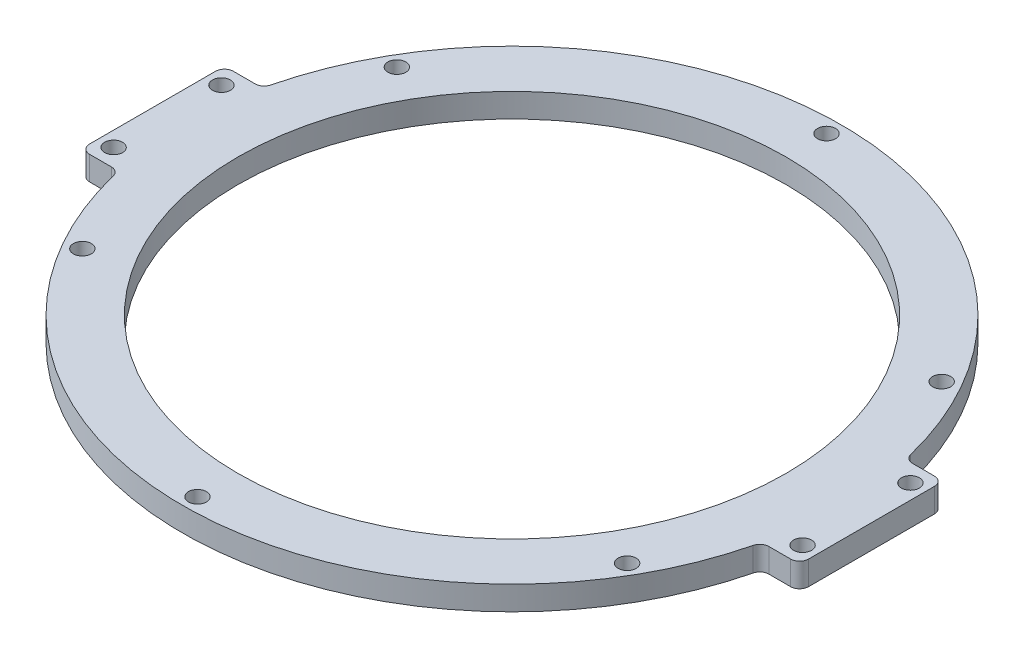
ISO-10303-21;
HEADER;
FILE_DESCRIPTION(('STEP AP214'),'2;1');
FILE_NAME('part.step','',(''),(''),'','','');
FILE_SCHEMA(('AUTOMOTIVE_DESIGN { 1 0 10303 214 1 1 1 1 }'));
ENDSEC;
DATA;
#1=APPLICATION_CONTEXT('core data for automotive mechanical design processes');
#2=APPLICATION_PROTOCOL_DEFINITION('international standard','automotive_design',2000,#1);
#3=PRODUCT_CONTEXT('',#1,'mechanical');
#4=PRODUCT('Part','Part','',(#3));
#5=PRODUCT_RELATED_PRODUCT_CATEGORY('part','',(#4));
#6=PRODUCT_DEFINITION_FORMATION('','',#4);
#7=PRODUCT_DEFINITION_CONTEXT('part definition',#1,'design');
#8=PRODUCT_DEFINITION('design','',#6,#7);
#9=PRODUCT_DEFINITION_SHAPE('','',#8);
#10=(LENGTH_UNIT() NAMED_UNIT(*) SI_UNIT(.MILLI.,.METRE.));
#11=(NAMED_UNIT(*) PLANE_ANGLE_UNIT() SI_UNIT($,.RADIAN.));
#12=(NAMED_UNIT(*) SI_UNIT($,.STERADIAN.) SOLID_ANGLE_UNIT());
#13=UNCERTAINTY_MEASURE_WITH_UNIT(LENGTH_MEASURE(1.E-05),#10,'distance_accuracy_value','');
#14=(GEOMETRIC_REPRESENTATION_CONTEXT(3) GLOBAL_UNCERTAINTY_ASSIGNED_CONTEXT((#13)) GLOBAL_UNIT_ASSIGNED_CONTEXT((#10,
#11,#12)) REPRESENTATION_CONTEXT('',''));
#15=CARTESIAN_POINT('',(0.,0.,0.));
#16=DIRECTION('',(0.,0.,1.));
#17=DIRECTION('',(1.,0.,0.));
#18=AXIS2_PLACEMENT_3D('',#15,#16,#17);
#19=CARTESIAN_POINT('',(58.5,4.,-10.5));
#20=DIRECTION('',(0.,-1.,0.));
#21=DIRECTION('',(0.,0.,-1.));
#22=AXIS2_PLACEMENT_3D('',#19,#20,#21);
#23=PLANE('',#22);
#24=CARTESIAN_POINT('',(58.5,4.,-10.5));
#25=DIRECTION('',(0.,1.,0.));
#26=DIRECTION('',(0.,0.,-1.));
#27=AXIS2_PLACEMENT_3D('',#24,#25,#26);
#28=CIRCLE('',#27,1.5);
#29=CARTESIAN_POINT('',(60.,4.,-10.5));
#30=VERTEX_POINT('',#29);
#31=CARTESIAN_POINT('',(58.5,4.,-12.));
#32=VERTEX_POINT('',#31);
#33=EDGE_CURVE('E242',#30,#32,#28,.T.);
#34=ORIENTED_EDGE('',*,*,#33,.T.);
#35=DIRECTION('',(-1.,0.,0.));
#36=VECTOR('',#35,1.);
#37=CARTESIAN_POINT('',(58.5,4.,-12.));
#38=LINE('',#37,#36);
#39=CARTESIAN_POINT('',(54.8634668973808,4.,-12.));
#40=VERTEX_POINT('',#39);
#41=EDGE_CURVE('E130',#32,#40,#38,.T.);
#42=ORIENTED_EDGE('',*,*,#41,.T.);
#43=CARTESIAN_POINT('',(54.8634668973808,4.,-13.5));
#44=DIRECTION('',(0.,-1.,0.));
#45=DIRECTION('',(0.,0.,1.));
#46=AXIS2_PLACEMENT_3D('',#43,#44,#45);
#47=CIRCLE('',#46,1.5);
#48=CARTESIAN_POINT('',(53.4069146788663,4.,-13.141592920354));
#49=VERTEX_POINT('',#48);
#50=EDGE_CURVE('E295',#40,#49,#47,.T.);
#51=ORIENTED_EDGE('',*,*,#50,.T.);
#52=CARTESIAN_POINT('',(0.,4.,0.));
#53=DIRECTION('',(0.,1.,0.));
#54=DIRECTION('',(0.,0.,1.));
#55=AXIS2_PLACEMENT_3D('',#52,#53,#54);
#56=CIRCLE('',#55,55.);
#57=CARTESIAN_POINT('',(-53.4069146788663,4.,-13.141592920354));
#58=VERTEX_POINT('',#57);
#59=EDGE_CURVE('E315',#49,#58,#56,.T.);
#60=ORIENTED_EDGE('',*,*,#59,.T.);
#61=CARTESIAN_POINT('',(-54.8634668973808,4.,-13.5));
#62=DIRECTION('',(0.,-1.,0.));
#63=DIRECTION('',(0.,0.,-1.));
#64=AXIS2_PLACEMENT_3D('',#61,#62,#63);
#65=CIRCLE('',#64,1.5);
#66=CARTESIAN_POINT('',(-54.8634668973808,4.,-12.));
#67=VERTEX_POINT('',#66);
#68=EDGE_CURVE('E311',#58,#67,#65,.T.);
#69=ORIENTED_EDGE('',*,*,#68,.T.);
#70=DIRECTION('',(-1.,0.,0.));
#71=VECTOR('',#70,1.);
#72=CARTESIAN_POINT('',(-58.5,4.,-12.));
#73=LINE('',#72,#71);
#74=CARTESIAN_POINT('',(-58.5,4.,-12.));
#75=VERTEX_POINT('',#74);
#76=EDGE_CURVE('E314',#67,#75,#73,.T.);
#77=ORIENTED_EDGE('',*,*,#76,.T.);
#78=CARTESIAN_POINT('',(-58.5,4.,-10.5));
#79=DIRECTION('',(0.,1.,0.));
#80=DIRECTION('',(0.,0.,1.));
#81=AXIS2_PLACEMENT_3D('',#78,#79,#80);
#82=CIRCLE('',#81,1.5);
#83=CARTESIAN_POINT('',(-60.,4.,-10.5));
#84=VERTEX_POINT('',#83);
#85=EDGE_CURVE('E319',#75,#84,#82,.T.);
#86=ORIENTED_EDGE('',*,*,#85,.T.);
#87=DIRECTION('',(0.,0.,1.));
#88=VECTOR('',#87,1.);
#89=CARTESIAN_POINT('',(-60.,4.,10.5));
#90=LINE('',#89,#88);
#91=CARTESIAN_POINT('',(-60.,4.,10.5));
#92=VERTEX_POINT('',#91);
#93=EDGE_CURVE('E326',#84,#92,#90,.T.);
#94=ORIENTED_EDGE('',*,*,#93,.T.);
#95=CARTESIAN_POINT('',(-58.5,4.,10.5));
#96=DIRECTION('',(0.,1.,0.));
#97=DIRECTION('',(0.,0.,-1.));
#98=AXIS2_PLACEMENT_3D('',#95,#96,#97);
#99=CIRCLE('',#98,1.5);
#100=CARTESIAN_POINT('',(-58.5,4.,12.));
#101=VERTEX_POINT('',#100);
#102=EDGE_CURVE('E329',#92,#101,#99,.T.);
#103=ORIENTED_EDGE('',*,*,#102,.T.);
#104=DIRECTION('',(1.,0.,0.));
#105=VECTOR('',#104,1.);
#106=CARTESIAN_POINT('',(-58.5,4.,12.));
#107=LINE('',#106,#105);
#108=CARTESIAN_POINT('',(-54.8634668973808,4.,12.));
#109=VERTEX_POINT('',#108);
#110=EDGE_CURVE('E332',#101,#109,#107,.T.);
#111=ORIENTED_EDGE('',*,*,#110,.T.);
#112=CARTESIAN_POINT('',(-54.8634668973808,4.,13.5));
#113=DIRECTION('',(0.,-1.,0.));
#114=DIRECTION('',(0.,0.,1.));
#115=AXIS2_PLACEMENT_3D('',#112,#113,#114);
#116=CIRCLE('',#115,1.5);
#117=CARTESIAN_POINT('',(-53.4069146788663,4.,13.141592920354));
#118=VERTEX_POINT('',#117);
#119=EDGE_CURVE('E335',#109,#118,#116,.T.);
#120=ORIENTED_EDGE('',*,*,#119,.T.);
#121=CARTESIAN_POINT('',(0.,4.,0.));
#122=DIRECTION('',(0.,1.,0.));
#123=DIRECTION('',(0.,0.,1.));
#124=AXIS2_PLACEMENT_3D('',#121,#122,#123);
#125=CIRCLE('',#124,55.);
#126=CARTESIAN_POINT('',(53.4069146788663,4.,13.141592920354));
#127=VERTEX_POINT('',#126);
#128=EDGE_CURVE('E338',#118,#127,#125,.T.);
#129=ORIENTED_EDGE('',*,*,#128,.T.);
#130=CARTESIAN_POINT('',(54.8634668973808,4.,13.5));
#131=DIRECTION('',(0.,-1.,0.));
#132=DIRECTION('',(0.,0.,-1.));
#133=AXIS2_PLACEMENT_3D('',#130,#131,#132);
#134=CIRCLE('',#133,1.5);
#135=CARTESIAN_POINT('',(54.8634668973808,4.,12.));
#136=VERTEX_POINT('',#135);
#137=EDGE_CURVE('E173',#127,#136,#134,.T.);
#138=ORIENTED_EDGE('',*,*,#137,.T.);
#139=DIRECTION('',(1.,0.,0.));
#140=VECTOR('',#139,1.);
#141=CARTESIAN_POINT('',(58.5,4.,12.));
#142=LINE('',#141,#140);
#143=CARTESIAN_POINT('',(58.5,4.,12.));
#144=VERTEX_POINT('',#143);
#145=EDGE_CURVE('E167',#136,#144,#142,.T.);
#146=ORIENTED_EDGE('',*,*,#145,.T.);
#147=CARTESIAN_POINT('',(58.5,4.,10.5));
#148=DIRECTION('',(0.,1.,0.));
#149=DIRECTION('',(0.,0.,1.));
#150=AXIS2_PLACEMENT_3D('',#147,#148,#149);
#151=CIRCLE('',#150,1.5);
#152=CARTESIAN_POINT('',(60.,4.,10.5));
#153=VERTEX_POINT('',#152);
#154=EDGE_CURVE('E171',#144,#153,#151,.T.);
#155=ORIENTED_EDGE('',*,*,#154,.T.);
#156=DIRECTION('',(0.,0.,-1.));
#157=VECTOR('',#156,1.);
#158=CARTESIAN_POINT('',(60.,4.,10.5));
#159=LINE('',#158,#157);
#160=EDGE_CURVE('E63',#153,#30,#159,.T.);
#161=ORIENTED_EDGE('',*,*,#160,.T.);
#162=EDGE_LOOP('',(#34,#42,#51,#60,#69,#77,#86,#94,#103,#111,#120,#129,#138,#146,#155,#161));
#163=FACE_BOUND('',#162,.T.);
#164=CARTESIAN_POINT('',(0.,4.,0.));
#165=DIRECTION('',(0.,1.,0.));
#166=DIRECTION('',(0.,0.,1.));
#167=AXIS2_PLACEMENT_3D('',#164,#165,#166);
#168=CIRCLE('',#167,45.75);
#169=CARTESIAN_POINT('',(0.,4.,45.75));
#170=VERTEX_POINT('',#169);
#171=EDGE_CURVE('E200',#170,#170,#168,.T.);
#172=ORIENTED_EDGE('',*,*,#171,.F.);
#173=EDGE_LOOP('',(#172));
#174=FACE_BOUND('',#173,.T.);
#175=CARTESIAN_POINT('',(0.,4.,-52.5));
#176=DIRECTION('',(0.,1.,0.));
#177=DIRECTION('',(0.,0.,1.));
#178=AXIS2_PLACEMENT_3D('',#175,#176,#177);
#179=CIRCLE('',#178,1.5);
#180=CARTESIAN_POINT('',(0.,4.,-51.));
#181=VERTEX_POINT('',#180);
#182=EDGE_CURVE('E492',#181,#181,#179,.T.);
#183=ORIENTED_EDGE('',*,*,#182,.F.);
#184=EDGE_LOOP('',(#183));
#185=FACE_BOUND('',#184,.T.);
#186=CARTESIAN_POINT('',(57.5,4.,-9.));
#187=DIRECTION('',(0.,1.,0.));
#188=DIRECTION('',(0.,0.,-1.));
#189=AXIS2_PLACEMENT_3D('',#186,#187,#188);
#190=CIRCLE('',#189,1.5);
#191=CARTESIAN_POINT('',(57.5,4.,-10.5));
#192=VERTEX_POINT('',#191);
#193=EDGE_CURVE('E484',#192,#192,#190,.T.);
#194=ORIENTED_EDGE('',*,*,#193,.F.);
#195=EDGE_LOOP('',(#194));
#196=FACE_BOUND('',#195,.T.);
#197=CARTESIAN_POINT('',(45.466333698683,4.,-26.25));
#198=DIRECTION('',(0.,1.,0.));
#199=DIRECTION('',(0.,0.,1.));
#200=AXIS2_PLACEMENT_3D('',#197,#198,#199);
#201=CIRCLE('',#200,1.5);
#202=CARTESIAN_POINT('',(45.466333698683,4.,-24.75));
#203=VERTEX_POINT('',#202);
#204=EDGE_CURVE('E476',#203,#203,#201,.T.);
#205=ORIENTED_EDGE('',*,*,#204,.F.);
#206=EDGE_LOOP('',(#205));
#207=FACE_BOUND('',#206,.T.);
#208=CARTESIAN_POINT('',(45.466333698683,4.,26.25));
#209=DIRECTION('',(0.,1.,0.));
#210=DIRECTION('',(0.,0.,1.));
#211=AXIS2_PLACEMENT_3D('',#208,#209,#210);
#212=CIRCLE('',#211,1.5);
#213=CARTESIAN_POINT('',(45.466333698683,4.,27.75));
#214=VERTEX_POINT('',#213);
#215=EDGE_CURVE('E468',#214,#214,#212,.T.);
#216=ORIENTED_EDGE('',*,*,#215,.F.);
#217=EDGE_LOOP('',(#216));
#218=FACE_BOUND('',#217,.T.);
#219=CARTESIAN_POINT('',(0.,4.,52.5));
#220=DIRECTION('',(0.,1.,0.));
#221=DIRECTION('',(0.,0.,1.));
#222=AXIS2_PLACEMENT_3D('',#219,#220,#221);
#223=CIRCLE('',#222,1.5);
#224=CARTESIAN_POINT('',(0.,4.,54.));
#225=VERTEX_POINT('',#224);
#226=EDGE_CURVE('E460',#225,#225,#223,.T.);
#227=ORIENTED_EDGE('',*,*,#226,.F.);
#228=EDGE_LOOP('',(#227));
#229=FACE_BOUND('',#228,.T.);
#230=CARTESIAN_POINT('',(-45.466333698683,4.,26.25));
#231=DIRECTION('',(0.,1.,0.));
#232=DIRECTION('',(0.,0.,1.));
#233=AXIS2_PLACEMENT_3D('',#230,#231,#232);
#234=CIRCLE('',#233,1.5);
#235=CARTESIAN_POINT('',(-45.466333698683,4.,27.75));
#236=VERTEX_POINT('',#235);
#237=EDGE_CURVE('E452',#236,#236,#234,.T.);
#238=ORIENTED_EDGE('',*,*,#237,.F.);
#239=EDGE_LOOP('',(#238));
#240=FACE_BOUND('',#239,.T.);
#241=CARTESIAN_POINT('',(-45.466333698683,4.,-26.25));
#242=DIRECTION('',(0.,1.,0.));
#243=DIRECTION('',(0.,0.,1.));
#244=AXIS2_PLACEMENT_3D('',#241,#242,#243);
#245=CIRCLE('',#244,1.5);
#246=CARTESIAN_POINT('',(-45.466333698683,4.,-24.75));
#247=VERTEX_POINT('',#246);
#248=EDGE_CURVE('E444',#247,#247,#245,.T.);
#249=ORIENTED_EDGE('',*,*,#248,.F.);
#250=EDGE_LOOP('',(#249));
#251=FACE_BOUND('',#250,.T.);
#252=CARTESIAN_POINT('',(-57.5,4.,-9.));
#253=DIRECTION('',(0.,1.,0.));
#254=DIRECTION('',(0.,0.,1.));
#255=AXIS2_PLACEMENT_3D('',#252,#253,#254);
#256=CIRCLE('',#255,1.5);
#257=CARTESIAN_POINT('',(-57.5,4.,-7.49999999999999));
#258=VERTEX_POINT('',#257);
#259=EDGE_CURVE('E436',#258,#258,#256,.T.);
#260=ORIENTED_EDGE('',*,*,#259,.F.);
#261=EDGE_LOOP('',(#260));
#262=FACE_BOUND('',#261,.T.);
#263=CARTESIAN_POINT('',(57.5,4.,9.));
#264=DIRECTION('',(0.,1.,0.));
#265=DIRECTION('',(0.,0.,1.));
#266=AXIS2_PLACEMENT_3D('',#263,#264,#265);
#267=CIRCLE('',#266,1.5);
#268=CARTESIAN_POINT('',(57.5,4.,10.5));
#269=VERTEX_POINT('',#268);
#270=EDGE_CURVE('E428',#269,#269,#267,.T.);
#271=ORIENTED_EDGE('',*,*,#270,.F.);
#272=EDGE_LOOP('',(#271));
#273=FACE_BOUND('',#272,.T.);
#274=CARTESIAN_POINT('',(-57.5,4.,9.));
#275=DIRECTION('',(0.,1.,0.));
#276=DIRECTION('',(0.,0.,-1.));
#277=AXIS2_PLACEMENT_3D('',#274,#275,#276);
#278=CIRCLE('',#277,1.5);
#279=CARTESIAN_POINT('',(-57.5,4.,7.49999999999999));
#280=VERTEX_POINT('',#279);
#281=EDGE_CURVE('E417',#280,#280,#278,.T.);
#282=ORIENTED_EDGE('',*,*,#281,.F.);
#283=EDGE_LOOP('',(#282));
#284=FACE_BOUND('',#283,.T.);
#285=ADVANCED_FACE('F45',(#163,#174,#185,#196,#207,#218,#229,#240,#251,#262,#273,#284),#23,.F.);
#286=CARTESIAN_POINT('',(58.5,0.,-10.5));
#287=DIRECTION('',(0.,-1.,0.));
#288=DIRECTION('',(0.,0.,-1.));
#289=AXIS2_PLACEMENT_3D('',#286,#287,#288);
#290=PLANE('',#289);
#291=CARTESIAN_POINT('',(57.5,0.,9.));
#292=DIRECTION('',(0.,1.,0.));
#293=DIRECTION('',(0.,0.,1.));
#294=AXIS2_PLACEMENT_3D('',#291,#292,#293);
#295=CIRCLE('',#294,1.5);
#296=CARTESIAN_POINT('',(57.5,0.,10.5));
#297=VERTEX_POINT('',#296);
#298=EDGE_CURVE('E425',#297,#297,#295,.T.);
#299=ORIENTED_EDGE('',*,*,#298,.T.);
#300=EDGE_LOOP('',(#299));
#301=FACE_BOUND('',#300,.T.);
#302=CARTESIAN_POINT('',(-45.466333698683,0.,-26.25));
#303=DIRECTION('',(0.,1.,0.));
#304=DIRECTION('',(0.,0.,1.));
#305=AXIS2_PLACEMENT_3D('',#302,#303,#304);
#306=CIRCLE('',#305,1.5);
#307=CARTESIAN_POINT('',(-45.466333698683,0.,-24.75));
#308=VERTEX_POINT('',#307);
#309=EDGE_CURVE('E440',#308,#308,#306,.T.);
#310=ORIENTED_EDGE('',*,*,#309,.T.);
#311=EDGE_LOOP('',(#310));
#312=FACE_BOUND('',#311,.T.);
#313=CARTESIAN_POINT('',(0.,0.,52.5));
#314=DIRECTION('',(0.,1.,0.));
#315=DIRECTION('',(0.,0.,1.));
#316=AXIS2_PLACEMENT_3D('',#313,#314,#315);
#317=CIRCLE('',#316,1.5);
#318=CARTESIAN_POINT('',(0.,0.,54.));
#319=VERTEX_POINT('',#318);
#320=EDGE_CURVE('E456',#319,#319,#317,.T.);
#321=ORIENTED_EDGE('',*,*,#320,.T.);
#322=EDGE_LOOP('',(#321));
#323=FACE_BOUND('',#322,.T.);
#324=CARTESIAN_POINT('',(45.466333698683,0.,-26.25));
#325=DIRECTION('',(0.,1.,0.));
#326=DIRECTION('',(0.,0.,1.));
#327=AXIS2_PLACEMENT_3D('',#324,#325,#326);
#328=CIRCLE('',#327,1.5);
#329=CARTESIAN_POINT('',(45.466333698683,0.,-24.75));
#330=VERTEX_POINT('',#329);
#331=EDGE_CURVE('E472',#330,#330,#328,.T.);
#332=ORIENTED_EDGE('',*,*,#331,.T.);
#333=EDGE_LOOP('',(#332));
#334=FACE_BOUND('',#333,.T.);
#335=CARTESIAN_POINT('',(0.,0.,-52.5));
#336=DIRECTION('',(0.,1.,0.));
#337=DIRECTION('',(0.,0.,1.));
#338=AXIS2_PLACEMENT_3D('',#335,#336,#337);
#339=CIRCLE('',#338,1.5);
#340=CARTESIAN_POINT('',(0.,0.,-51.));
#341=VERTEX_POINT('',#340);
#342=EDGE_CURVE('E488',#341,#341,#339,.T.);
#343=ORIENTED_EDGE('',*,*,#342,.T.);
#344=EDGE_LOOP('',(#343));
#345=FACE_BOUND('',#344,.T.);
#346=CARTESIAN_POINT('',(58.5,0.,-10.5));
#347=DIRECTION('',(0.,1.,0.));
#348=DIRECTION('',(0.,0.,-1.));
#349=AXIS2_PLACEMENT_3D('',#346,#347,#348);
#350=CIRCLE('',#349,1.5);
#351=CARTESIAN_POINT('',(60.,0.,-10.5));
#352=VERTEX_POINT('',#351);
#353=CARTESIAN_POINT('',(58.5,0.,-12.));
#354=VERTEX_POINT('',#353);
#355=EDGE_CURVE('E195',#352,#354,#350,.T.);
#356=ORIENTED_EDGE('',*,*,#355,.F.);
#357=DIRECTION('',(0.,0.,-1.));
#358=VECTOR('',#357,1.);
#359=CARTESIAN_POINT('',(60.,0.,10.5));
#360=LINE('',#359,#358);
#361=CARTESIAN_POINT('',(60.,0.,10.5));
#362=VERTEX_POINT('',#361);
#363=EDGE_CURVE('E122',#362,#352,#360,.T.);
#364=ORIENTED_EDGE('',*,*,#363,.F.);
#365=CARTESIAN_POINT('',(58.5,0.,10.5));
#366=DIRECTION('',(0.,1.,0.));
#367=DIRECTION('',(0.,0.,1.));
#368=AXIS2_PLACEMENT_3D('',#365,#366,#367);
#369=CIRCLE('',#368,1.5);
#370=CARTESIAN_POINT('',(58.5,0.,12.));
#371=VERTEX_POINT('',#370);
#372=EDGE_CURVE('E116',#371,#362,#369,.T.);
#373=ORIENTED_EDGE('',*,*,#372,.F.);
#374=DIRECTION('',(1.,0.,0.));
#375=VECTOR('',#374,1.);
#376=CARTESIAN_POINT('',(58.5,0.,12.));
#377=LINE('',#376,#375);
#378=CARTESIAN_POINT('',(54.8634668973808,0.,12.));
#379=VERTEX_POINT('',#378);
#380=EDGE_CURVE('E182',#379,#371,#377,.T.);
#381=ORIENTED_EDGE('',*,*,#380,.F.);
#382=CARTESIAN_POINT('',(54.8634668973808,0.,13.5));
#383=DIRECTION('',(0.,-1.,0.));
#384=DIRECTION('',(0.,0.,-1.));
#385=AXIS2_PLACEMENT_3D('',#382,#383,#384);
#386=CIRCLE('',#385,1.5);
#387=CARTESIAN_POINT('',(53.4069146788663,0.,13.141592920354));
#388=VERTEX_POINT('',#387);
#389=EDGE_CURVE('E233',#388,#379,#386,.T.);
#390=ORIENTED_EDGE('',*,*,#389,.F.);
#391=CARTESIAN_POINT('',(0.,0.,0.));
#392=DIRECTION('',(0.,1.,0.));
#393=DIRECTION('',(0.,0.,1.));
#394=AXIS2_PLACEMENT_3D('',#391,#392,#393);
#395=CIRCLE('',#394,55.);
#396=CARTESIAN_POINT('',(-53.4069146788663,0.,13.141592920354));
#397=VERTEX_POINT('',#396);
#398=EDGE_CURVE('E230',#397,#388,#395,.T.);
#399=ORIENTED_EDGE('',*,*,#398,.F.);
#400=CARTESIAN_POINT('',(-54.8634668973808,0.,13.5));
#401=DIRECTION('',(0.,-1.,0.));
#402=DIRECTION('',(0.,0.,1.));
#403=AXIS2_PLACEMENT_3D('',#400,#401,#402);
#404=CIRCLE('',#403,1.5);
#405=CARTESIAN_POINT('',(-54.8634668973808,0.,12.));
#406=VERTEX_POINT('',#405);
#407=EDGE_CURVE('E227',#406,#397,#404,.T.);
#408=ORIENTED_EDGE('',*,*,#407,.F.);
#409=DIRECTION('',(1.,0.,0.));
#410=VECTOR('',#409,1.);
#411=CARTESIAN_POINT('',(-58.5,0.,12.));
#412=LINE('',#411,#410);
#413=CARTESIAN_POINT('',(-58.5,0.,12.));
#414=VERTEX_POINT('',#413);
#415=EDGE_CURVE('E224',#414,#406,#412,.T.);
#416=ORIENTED_EDGE('',*,*,#415,.F.);
#417=CARTESIAN_POINT('',(-58.5,0.,10.5));
#418=DIRECTION('',(0.,1.,0.));
#419=DIRECTION('',(0.,0.,-1.));
#420=AXIS2_PLACEMENT_3D('',#417,#418,#419);
#421=CIRCLE('',#420,1.5);
#422=CARTESIAN_POINT('',(-60.,0.,10.5));
#423=VERTEX_POINT('',#422);
#424=EDGE_CURVE('E221',#423,#414,#421,.T.);
#425=ORIENTED_EDGE('',*,*,#424,.F.);
#426=DIRECTION('',(0.,0.,1.));
#427=VECTOR('',#426,1.);
#428=CARTESIAN_POINT('',(-60.,0.,10.5));
#429=LINE('',#428,#427);
#430=CARTESIAN_POINT('',(-60.,0.,-10.5));
#431=VERTEX_POINT('',#430);
#432=EDGE_CURVE('E218',#431,#423,#429,.T.);
#433=ORIENTED_EDGE('',*,*,#432,.F.);
#434=CARTESIAN_POINT('',(-58.5,0.,-10.5));
#435=DIRECTION('',(0.,1.,0.));
#436=DIRECTION('',(0.,0.,1.));
#437=AXIS2_PLACEMENT_3D('',#434,#435,#436);
#438=CIRCLE('',#437,1.5);
#439=CARTESIAN_POINT('',(-58.5,0.,-12.));
#440=VERTEX_POINT('',#439);
#441=EDGE_CURVE('E215',#440,#431,#438,.T.);
#442=ORIENTED_EDGE('',*,*,#441,.F.);
#443=DIRECTION('',(-1.,0.,0.));
#444=VECTOR('',#443,1.);
#445=CARTESIAN_POINT('',(-58.5,0.,-12.));
#446=LINE('',#445,#444);
#447=CARTESIAN_POINT('',(-54.8634668973808,0.,-12.));
#448=VERTEX_POINT('',#447);
#449=EDGE_CURVE('E212',#448,#440,#446,.T.);
#450=ORIENTED_EDGE('',*,*,#449,.F.);
#451=CARTESIAN_POINT('',(-54.8634668973808,0.,-13.5));
#452=DIRECTION('',(0.,-1.,0.));
#453=DIRECTION('',(0.,0.,-1.));
#454=AXIS2_PLACEMENT_3D('',#451,#452,#453);
#455=CIRCLE('',#454,1.5);
#456=CARTESIAN_POINT('',(-53.4069146788663,0.,-13.141592920354));
#457=VERTEX_POINT('',#456);
#458=EDGE_CURVE('E209',#457,#448,#455,.T.);
#459=ORIENTED_EDGE('',*,*,#458,.F.);
#460=CARTESIAN_POINT('',(0.,0.,0.));
#461=DIRECTION('',(0.,1.,0.));
#462=DIRECTION('',(0.,0.,1.));
#463=AXIS2_PLACEMENT_3D('',#460,#461,#462);
#464=CIRCLE('',#463,55.);
#465=CARTESIAN_POINT('',(53.4069146788663,0.,-13.141592920354));
#466=VERTEX_POINT('',#465);
#467=EDGE_CURVE('E206',#466,#457,#464,.T.);
#468=ORIENTED_EDGE('',*,*,#467,.F.);
#469=CARTESIAN_POINT('',(54.8634668973808,0.,-13.5));
#470=DIRECTION('',(0.,-1.,0.));
#471=DIRECTION('',(0.,0.,1.));
#472=AXIS2_PLACEMENT_3D('',#469,#470,#471);
#473=CIRCLE('',#472,1.5);
#474=CARTESIAN_POINT('',(54.8634668973808,0.,-12.));
#475=VERTEX_POINT('',#474);
#476=EDGE_CURVE('E203',#475,#466,#473,.T.);
#477=ORIENTED_EDGE('',*,*,#476,.F.);
#478=DIRECTION('',(-1.,0.,0.));
#479=VECTOR('',#478,1.);
#480=CARTESIAN_POINT('',(58.5,0.,-12.));
#481=LINE('',#480,#479);
#482=EDGE_CURVE('E199',#354,#475,#481,.T.);
#483=ORIENTED_EDGE('',*,*,#482,.F.);
#484=EDGE_LOOP('',(#356,#364,#373,#381,#390,#399,#408,#416,#425,#433,#442,#450,#459,#468,#477,#483));
#485=FACE_BOUND('',#484,.T.);
#486=CARTESIAN_POINT('',(0.,0.,0.));
#487=DIRECTION('',(0.,1.,0.));
#488=DIRECTION('',(0.,0.,1.));
#489=AXIS2_PLACEMENT_3D('',#486,#487,#488);
#490=CIRCLE('',#489,45.75);
#491=CARTESIAN_POINT('',(0.,0.,45.75));
#492=VERTEX_POINT('',#491);
#493=EDGE_CURVE('E496',#492,#492,#490,.T.);
#494=ORIENTED_EDGE('',*,*,#493,.T.);
#495=EDGE_LOOP('',(#494));
#496=FACE_BOUND('',#495,.T.);
#497=CARTESIAN_POINT('',(57.5,0.,-9.));
#498=DIRECTION('',(0.,1.,0.));
#499=DIRECTION('',(0.,0.,-1.));
#500=AXIS2_PLACEMENT_3D('',#497,#498,#499);
#501=CIRCLE('',#500,1.5);
#502=CARTESIAN_POINT('',(57.5,0.,-10.5));
#503=VERTEX_POINT('',#502);
#504=EDGE_CURVE('E480',#503,#503,#501,.T.);
#505=ORIENTED_EDGE('',*,*,#504,.T.);
#506=EDGE_LOOP('',(#505));
#507=FACE_BOUND('',#506,.T.);
#508=CARTESIAN_POINT('',(45.466333698683,0.,26.25));
#509=DIRECTION('',(0.,1.,0.));
#510=DIRECTION('',(0.,0.,1.));
#511=AXIS2_PLACEMENT_3D('',#508,#509,#510);
#512=CIRCLE('',#511,1.5);
#513=CARTESIAN_POINT('',(45.466333698683,0.,27.75));
#514=VERTEX_POINT('',#513);
#515=EDGE_CURVE('E464',#514,#514,#512,.T.);
#516=ORIENTED_EDGE('',*,*,#515,.T.);
#517=EDGE_LOOP('',(#516));
#518=FACE_BOUND('',#517,.T.);
#519=CARTESIAN_POINT('',(-45.466333698683,0.,26.25));
#520=DIRECTION('',(0.,1.,0.));
#521=DIRECTION('',(0.,0.,1.));
#522=AXIS2_PLACEMENT_3D('',#519,#520,#521);
#523=CIRCLE('',#522,1.5);
#524=CARTESIAN_POINT('',(-45.466333698683,0.,27.75));
#525=VERTEX_POINT('',#524);
#526=EDGE_CURVE('E448',#525,#525,#523,.T.);
#527=ORIENTED_EDGE('',*,*,#526,.T.);
#528=EDGE_LOOP('',(#527));
#529=FACE_BOUND('',#528,.T.);
#530=CARTESIAN_POINT('',(-57.5,0.,-9.));
#531=DIRECTION('',(0.,1.,0.));
#532=DIRECTION('',(0.,0.,1.));
#533=AXIS2_PLACEMENT_3D('',#530,#531,#532);
#534=CIRCLE('',#533,1.5);
#535=CARTESIAN_POINT('',(-57.5,0.,-7.49999999999999));
#536=VERTEX_POINT('',#535);
#537=EDGE_CURVE('E432',#536,#536,#534,.T.);
#538=ORIENTED_EDGE('',*,*,#537,.T.);
#539=EDGE_LOOP('',(#538));
#540=FACE_BOUND('',#539,.T.);
#541=CARTESIAN_POINT('',(-57.5,0.,9.));
#542=DIRECTION('',(0.,1.,0.));
#543=DIRECTION('',(0.,0.,-1.));
#544=AXIS2_PLACEMENT_3D('',#541,#542,#543);
#545=CIRCLE('',#544,1.5);
#546=CARTESIAN_POINT('',(-57.5,0.,7.49999999999999));
#547=VERTEX_POINT('',#546);
#548=EDGE_CURVE('E420',#547,#547,#545,.T.);
#549=ORIENTED_EDGE('',*,*,#548,.T.);
#550=EDGE_LOOP('',(#549));
#551=FACE_BOUND('',#550,.T.);
#552=ADVANCED_FACE('F299',(#301,#312,#323,#334,#345,#485,#496,#507,#518,#529,#540,#551),#290,.T.);
#553=CARTESIAN_POINT('',(58.5,4.,-10.5));
#554=DIRECTION('',(0.,-1.,0.));
#555=DIRECTION('',(0.,0.,-1.));
#556=AXIS2_PLACEMENT_3D('',#553,#554,#555);
#557=CYLINDRICAL_SURFACE('',#556,1.5);
#558=ORIENTED_EDGE('',*,*,#355,.T.);
#559=DIRECTION('',(0.,-1.,0.));
#560=VECTOR('',#559,1.);
#561=CARTESIAN_POINT('',(58.5,4.,-12.));
#562=LINE('',#561,#560);
#563=EDGE_CURVE('E11',#32,#354,#562,.T.);
#564=ORIENTED_EDGE('',*,*,#563,.F.);
#565=ORIENTED_EDGE('',*,*,#33,.F.);
#566=DIRECTION('',(0.,-1.,0.));
#567=VECTOR('',#566,1.);
#568=CARTESIAN_POINT('',(60.,4.,-10.5));
#569=LINE('',#568,#567);
#570=EDGE_CURVE('E191',#30,#352,#569,.T.);
#571=ORIENTED_EDGE('',*,*,#570,.T.);
#572=EDGE_LOOP('',(#558,#564,#565,#571));
#573=FACE_BOUND('',#572,.T.);
#574=ADVANCED_FACE('F47',(#573),#557,.T.);
#575=CARTESIAN_POINT('',(58.5,4.,-12.));
#576=DIRECTION('',(0.,0.,1.));
#577=DIRECTION('',(1.,0.,0.));
#578=AXIS2_PLACEMENT_3D('',#575,#576,#577);
#579=PLANE('',#578);
#580=ORIENTED_EDGE('',*,*,#482,.T.);
#581=DIRECTION('',(0.,-1.,0.));
#582=VECTOR('',#581,1.);
#583=CARTESIAN_POINT('',(54.8634668973808,4.,-12.));
#584=LINE('',#583,#582);
#585=EDGE_CURVE('E55',#40,#475,#584,.T.);
#586=ORIENTED_EDGE('',*,*,#585,.F.);
#587=ORIENTED_EDGE('',*,*,#41,.F.);
#588=ORIENTED_EDGE('',*,*,#563,.T.);
#589=EDGE_LOOP('',(#580,#586,#587,#588));
#590=FACE_BOUND('',#589,.T.);
#591=ADVANCED_FACE('F728',(#590),#579,.F.);
#592=CARTESIAN_POINT('',(54.8634668973808,4.,-13.5));
#593=DIRECTION('',(0.,-1.,0.));
#594=DIRECTION('',(0.,0.,-1.));
#595=AXIS2_PLACEMENT_3D('',#592,#593,#594);
#596=CYLINDRICAL_SURFACE('',#595,1.5);
#597=ORIENTED_EDGE('',*,*,#476,.T.);
#598=DIRECTION('',(0.,-1.,0.));
#599=VECTOR('',#598,1.);
#600=CARTESIAN_POINT('',(53.4069146788663,4.,-13.141592920354));
#601=LINE('',#600,#599);
#602=EDGE_CURVE('E285',#49,#466,#601,.T.);
#603=ORIENTED_EDGE('',*,*,#602,.F.);
#604=ORIENTED_EDGE('',*,*,#50,.F.);
#605=ORIENTED_EDGE('',*,*,#585,.T.);
#606=EDGE_LOOP('',(#597,#603,#604,#605));
#607=FACE_BOUND('',#606,.T.);
#608=ADVANCED_FACE('F293',(#607),#596,.F.);
#609=CARTESIAN_POINT('',(0.,4.,0.));
#610=DIRECTION('',(0.,-1.,0.));
#611=DIRECTION('',(0.,0.,-1.));
#612=AXIS2_PLACEMENT_3D('',#609,#610,#611);
#613=CYLINDRICAL_SURFACE('',#612,55.);
#614=ORIENTED_EDGE('',*,*,#467,.T.);
#615=DIRECTION('',(0.,-1.,0.));
#616=VECTOR('',#615,1.);
#617=CARTESIAN_POINT('',(-53.4069146788663,4.,-13.141592920354));
#618=LINE('',#617,#616);
#619=EDGE_CURVE('E281',#58,#457,#618,.T.);
#620=ORIENTED_EDGE('',*,*,#619,.F.);
#621=ORIENTED_EDGE('',*,*,#59,.F.);
#622=ORIENTED_EDGE('',*,*,#602,.T.);
#623=EDGE_LOOP('',(#614,#620,#621,#622));
#624=FACE_BOUND('',#623,.T.);
#625=ADVANCED_FACE('F305',(#624),#613,.T.);
#626=CARTESIAN_POINT('',(-54.8634668973808,4.,-13.5));
#627=DIRECTION('',(0.,-1.,0.));
#628=DIRECTION('',(0.,0.,-1.));
#629=AXIS2_PLACEMENT_3D('',#626,#627,#628);
#630=CYLINDRICAL_SURFACE('',#629,1.5);
#631=ORIENTED_EDGE('',*,*,#458,.T.);
#632=DIRECTION('',(0.,-1.,0.));
#633=VECTOR('',#632,1.);
#634=CARTESIAN_POINT('',(-54.8634668973808,4.,-12.));
#635=LINE('',#634,#633);
#636=EDGE_CURVE('E277',#67,#448,#635,.T.);
#637=ORIENTED_EDGE('',*,*,#636,.F.);
#638=ORIENTED_EDGE('',*,*,#68,.F.);
#639=ORIENTED_EDGE('',*,*,#619,.T.);
#640=EDGE_LOOP('',(#631,#637,#638,#639));
#641=FACE_BOUND('',#640,.T.);
#642=ADVANCED_FACE('F309',(#641),#630,.F.);
#643=CARTESIAN_POINT('',(-58.5,4.,-12.));
#644=DIRECTION('',(0.,0.,1.));
#645=DIRECTION('',(1.,0.,0.));
#646=AXIS2_PLACEMENT_3D('',#643,#644,#645);
#647=PLANE('',#646);
#648=ORIENTED_EDGE('',*,*,#449,.T.);
#649=DIRECTION('',(0.,-1.,0.));
#650=VECTOR('',#649,1.);
#651=CARTESIAN_POINT('',(-58.5,4.,-12.));
#652=LINE('',#651,#650);
#653=EDGE_CURVE('E273',#75,#440,#652,.T.);
#654=ORIENTED_EDGE('',*,*,#653,.F.);
#655=ORIENTED_EDGE('',*,*,#76,.F.);
#656=ORIENTED_EDGE('',*,*,#636,.T.);
#657=EDGE_LOOP('',(#648,#654,#655,#656));
#658=FACE_BOUND('',#657,.T.);
#659=ADVANCED_FACE('F693',(#658),#647,.F.);
#660=CARTESIAN_POINT('',(-58.5,4.,-10.5));
#661=DIRECTION('',(0.,-1.,0.));
#662=DIRECTION('',(0.,0.,-1.));
#663=AXIS2_PLACEMENT_3D('',#660,#661,#662);
#664=CYLINDRICAL_SURFACE('',#663,1.5);
#665=ORIENTED_EDGE('',*,*,#441,.T.);
#666=DIRECTION('',(0.,-1.,0.));
#667=VECTOR('',#666,1.);
#668=CARTESIAN_POINT('',(-60.,4.,-10.5));
#669=LINE('',#668,#667);
#670=EDGE_CURVE('E269',#84,#431,#669,.T.);
#671=ORIENTED_EDGE('',*,*,#670,.F.);
#672=ORIENTED_EDGE('',*,*,#85,.F.);
#673=ORIENTED_EDGE('',*,*,#653,.T.);
#674=EDGE_LOOP('',(#665,#671,#672,#673));
#675=FACE_BOUND('',#674,.T.);
#676=ADVANCED_FACE('F683',(#675),#664,.T.);
#677=CARTESIAN_POINT('',(-60.,4.,10.5));
#678=DIRECTION('',(1.,0.,0.));
#679=DIRECTION('',(0.,0.,-1.));
#680=AXIS2_PLACEMENT_3D('',#677,#678,#679);
#681=PLANE('',#680);
#682=ORIENTED_EDGE('',*,*,#432,.T.);
#683=DIRECTION('',(0.,-1.,0.));
#684=VECTOR('',#683,1.);
#685=CARTESIAN_POINT('',(-60.,4.,10.5));
#686=LINE('',#685,#684);
#687=EDGE_CURVE('E265',#92,#423,#686,.T.);
#688=ORIENTED_EDGE('',*,*,#687,.F.);
#689=ORIENTED_EDGE('',*,*,#93,.F.);
#690=ORIENTED_EDGE('',*,*,#670,.T.);
#691=EDGE_LOOP('',(#682,#688,#689,#690));
#692=FACE_BOUND('',#691,.T.);
#693=ADVANCED_FACE('F673',(#692),#681,.F.);
#694=CARTESIAN_POINT('',(-58.5,4.,10.5));
#695=DIRECTION('',(0.,-1.,0.));
#696=DIRECTION('',(0.,0.,-1.));
#697=AXIS2_PLACEMENT_3D('',#694,#695,#696);
#698=CYLINDRICAL_SURFACE('',#697,1.5);
#699=ORIENTED_EDGE('',*,*,#424,.T.);
#700=DIRECTION('',(0.,-1.,0.));
#701=VECTOR('',#700,1.);
#702=CARTESIAN_POINT('',(-58.5,4.,12.));
#703=LINE('',#702,#701);
#704=EDGE_CURVE('E261',#101,#414,#703,.T.);
#705=ORIENTED_EDGE('',*,*,#704,.F.);
#706=ORIENTED_EDGE('',*,*,#102,.F.);
#707=ORIENTED_EDGE('',*,*,#687,.T.);
#708=EDGE_LOOP('',(#699,#705,#706,#707));
#709=FACE_BOUND('',#708,.T.);
#710=ADVANCED_FACE('F663',(#709),#698,.T.);
#711=CARTESIAN_POINT('',(-58.5,4.,12.));
#712=DIRECTION('',(0.,0.,-1.));
#713=DIRECTION('',(-1.,0.,0.));
#714=AXIS2_PLACEMENT_3D('',#711,#712,#713);
#715=PLANE('',#714);
#716=ORIENTED_EDGE('',*,*,#415,.T.);
#717=DIRECTION('',(0.,-1.,0.));
#718=VECTOR('',#717,1.);
#719=CARTESIAN_POINT('',(-54.8634668973808,4.,12.));
#720=LINE('',#719,#718);
#721=EDGE_CURVE('E257',#109,#406,#720,.T.);
#722=ORIENTED_EDGE('',*,*,#721,.F.);
#723=ORIENTED_EDGE('',*,*,#110,.F.);
#724=ORIENTED_EDGE('',*,*,#704,.T.);
#725=EDGE_LOOP('',(#716,#722,#723,#724));
#726=FACE_BOUND('',#725,.T.);
#727=ADVANCED_FACE('F653',(#726),#715,.F.);
#728=CARTESIAN_POINT('',(-54.8634668973808,4.,13.5));
#729=DIRECTION('',(0.,-1.,0.));
#730=DIRECTION('',(0.,0.,-1.));
#731=AXIS2_PLACEMENT_3D('',#728,#729,#730);
#732=CYLINDRICAL_SURFACE('',#731,1.5);
#733=ORIENTED_EDGE('',*,*,#407,.T.);
#734=DIRECTION('',(0.,-1.,0.));
#735=VECTOR('',#734,1.);
#736=CARTESIAN_POINT('',(-53.4069146788663,4.,13.141592920354));
#737=LINE('',#736,#735);
#738=EDGE_CURVE('E253',#118,#397,#737,.T.);
#739=ORIENTED_EDGE('',*,*,#738,.F.);
#740=ORIENTED_EDGE('',*,*,#119,.F.);
#741=ORIENTED_EDGE('',*,*,#721,.T.);
#742=EDGE_LOOP('',(#733,#739,#740,#741));
#743=FACE_BOUND('',#742,.T.);
#744=ADVANCED_FACE('F644',(#743),#732,.F.);
#745=CARTESIAN_POINT('',(0.,4.,0.));
#746=DIRECTION('',(0.,-1.,0.));
#747=DIRECTION('',(0.,0.,-1.));
#748=AXIS2_PLACEMENT_3D('',#745,#746,#747);
#749=CYLINDRICAL_SURFACE('',#748,55.);
#750=ORIENTED_EDGE('',*,*,#398,.T.);
#751=DIRECTION('',(0.,-1.,0.));
#752=VECTOR('',#751,1.);
#753=CARTESIAN_POINT('',(53.4069146788663,4.,13.141592920354));
#754=LINE('',#753,#752);
#755=EDGE_CURVE('E249',#127,#388,#754,.T.);
#756=ORIENTED_EDGE('',*,*,#755,.F.);
#757=ORIENTED_EDGE('',*,*,#128,.F.);
#758=ORIENTED_EDGE('',*,*,#738,.T.);
#759=EDGE_LOOP('',(#750,#756,#757,#758));
#760=FACE_BOUND('',#759,.T.);
#761=ADVANCED_FACE('F346',(#760),#749,.T.);
#762=CARTESIAN_POINT('',(54.8634668973808,4.,13.5));
#763=DIRECTION('',(0.,-1.,0.));
#764=DIRECTION('',(0.,0.,-1.));
#765=AXIS2_PLACEMENT_3D('',#762,#763,#764);
#766=CYLINDRICAL_SURFACE('',#765,1.5);
#767=ORIENTED_EDGE('',*,*,#389,.T.);
#768=DIRECTION('',(0.,-1.,0.));
#769=VECTOR('',#768,1.);
#770=CARTESIAN_POINT('',(54.8634668973808,4.,12.));
#771=LINE('',#770,#769);
#772=EDGE_CURVE('E184',#136,#379,#771,.T.);
#773=ORIENTED_EDGE('',*,*,#772,.F.);
#774=ORIENTED_EDGE('',*,*,#137,.F.);
#775=ORIENTED_EDGE('',*,*,#755,.T.);
#776=EDGE_LOOP('',(#767,#773,#774,#775));
#777=FACE_BOUND('',#776,.T.);
#778=ADVANCED_FACE('F350',(#777),#766,.F.);
#779=CARTESIAN_POINT('',(58.5,4.,12.));
#780=DIRECTION('',(0.,0.,-1.));
#781=DIRECTION('',(-1.,0.,0.));
#782=AXIS2_PLACEMENT_3D('',#779,#780,#781);
#783=PLANE('',#782);
#784=ORIENTED_EDGE('',*,*,#380,.T.);
#785=DIRECTION('',(0.,-1.,0.));
#786=VECTOR('',#785,1.);
#787=CARTESIAN_POINT('',(58.5,4.,12.));
#788=LINE('',#787,#786);
#789=EDGE_CURVE('E179',#144,#371,#788,.T.);
#790=ORIENTED_EDGE('',*,*,#789,.F.);
#791=ORIENTED_EDGE('',*,*,#145,.F.);
#792=ORIENTED_EDGE('',*,*,#772,.T.);
#793=EDGE_LOOP('',(#784,#790,#791,#792));
#794=FACE_BOUND('',#793,.T.);
#795=ADVANCED_FACE('F180',(#794),#783,.F.);
#796=CARTESIAN_POINT('',(58.5,4.,10.5));
#797=DIRECTION('',(0.,-1.,0.));
#798=DIRECTION('',(0.,0.,-1.));
#799=AXIS2_PLACEMENT_3D('',#796,#797,#798);
#800=CYLINDRICAL_SURFACE('',#799,1.5);
#801=ORIENTED_EDGE('',*,*,#372,.T.);
#802=DIRECTION('',(0.,-1.,0.));
#803=VECTOR('',#802,1.);
#804=CARTESIAN_POINT('',(60.,4.,10.5));
#805=LINE('',#804,#803);
#806=EDGE_CURVE('E185',#153,#362,#805,.T.);
#807=ORIENTED_EDGE('',*,*,#806,.F.);
#808=ORIENTED_EDGE('',*,*,#154,.F.);
#809=ORIENTED_EDGE('',*,*,#789,.T.);
#810=EDGE_LOOP('',(#801,#807,#808,#809));
#811=FACE_BOUND('',#810,.T.);
#812=ADVANCED_FACE('F187',(#811),#800,.T.);
#813=CARTESIAN_POINT('',(60.,4.,10.5));
#814=DIRECTION('',(-1.,0.,0.));
#815=DIRECTION('',(0.,0.,1.));
#816=AXIS2_PLACEMENT_3D('',#813,#814,#815);
#817=PLANE('',#816);
#818=ORIENTED_EDGE('',*,*,#363,.T.);
#819=ORIENTED_EDGE('',*,*,#570,.F.);
#820=ORIENTED_EDGE('',*,*,#160,.F.);
#821=ORIENTED_EDGE('',*,*,#806,.T.);
#822=EDGE_LOOP('',(#818,#819,#820,#821));
#823=FACE_BOUND('',#822,.T.);
#824=ADVANCED_FACE('F354',(#823),#817,.F.);
#825=CARTESIAN_POINT('',(0.,4.,0.));
#826=DIRECTION('',(0.,-1.,0.));
#827=DIRECTION('',(0.,0.,-1.));
#828=AXIS2_PLACEMENT_3D('',#825,#826,#827);
#829=CYLINDRICAL_SURFACE('',#828,45.75);
#830=ORIENTED_EDGE('',*,*,#171,.T.);
#831=EDGE_LOOP('',(#830));
#832=FACE_BOUND('',#831,.T.);
#833=ORIENTED_EDGE('',*,*,#493,.F.);
#834=EDGE_LOOP('',(#833));
#835=FACE_BOUND('',#834,.T.);
#836=ADVANCED_FACE('F356',(#832,#835),#829,.F.);
#837=CARTESIAN_POINT('',(0.,4.,-52.5));
#838=DIRECTION('',(0.,-1.,0.));
#839=DIRECTION('',(0.,0.,-1.));
#840=AXIS2_PLACEMENT_3D('',#837,#838,#839);
#841=CYLINDRICAL_SURFACE('',#840,1.5);
#842=ORIENTED_EDGE('',*,*,#182,.T.);
#843=EDGE_LOOP('',(#842));
#844=FACE_BOUND('',#843,.T.);
#845=ORIENTED_EDGE('',*,*,#342,.F.);
#846=EDGE_LOOP('',(#845));
#847=FACE_BOUND('',#846,.T.);
#848=ADVANCED_FACE('F362',(#844,#847),#841,.F.);
#849=CARTESIAN_POINT('',(57.5,4.,-9.));
#850=DIRECTION('',(0.,-1.,0.));
#851=DIRECTION('',(0.,0.,-1.));
#852=AXIS2_PLACEMENT_3D('',#849,#850,#851);
#853=CYLINDRICAL_SURFACE('',#852,1.5);
#854=ORIENTED_EDGE('',*,*,#193,.T.);
#855=EDGE_LOOP('',(#854));
#856=FACE_BOUND('',#855,.T.);
#857=ORIENTED_EDGE('',*,*,#504,.F.);
#858=EDGE_LOOP('',(#857));
#859=FACE_BOUND('',#858,.T.);
#860=ADVANCED_FACE('F376',(#856,#859),#853,.F.);
#861=CARTESIAN_POINT('',(45.466333698683,4.,-26.25));
#862=DIRECTION('',(0.,-1.,0.));
#863=DIRECTION('',(0.,0.,-1.));
#864=AXIS2_PLACEMENT_3D('',#861,#862,#863);
#865=CYLINDRICAL_SURFACE('',#864,1.5);
#866=ORIENTED_EDGE('',*,*,#204,.T.);
#867=EDGE_LOOP('',(#866));
#868=FACE_BOUND('',#867,.T.);
#869=ORIENTED_EDGE('',*,*,#331,.F.);
#870=EDGE_LOOP('',(#869));
#871=FACE_BOUND('',#870,.T.);
#872=ADVANCED_FACE('F380',(#868,#871),#865,.F.);
#873=CARTESIAN_POINT('',(45.466333698683,4.,26.25));
#874=DIRECTION('',(0.,-1.,0.));
#875=DIRECTION('',(0.,0.,-1.));
#876=AXIS2_PLACEMENT_3D('',#873,#874,#875);
#877=CYLINDRICAL_SURFACE('',#876,1.5);
#878=ORIENTED_EDGE('',*,*,#215,.T.);
#879=EDGE_LOOP('',(#878));
#880=FACE_BOUND('',#879,.T.);
#881=ORIENTED_EDGE('',*,*,#515,.F.);
#882=EDGE_LOOP('',(#881));
#883=FACE_BOUND('',#882,.T.);
#884=ADVANCED_FACE('F384',(#880,#883),#877,.F.);
#885=CARTESIAN_POINT('',(0.,4.,52.5));
#886=DIRECTION('',(0.,-1.,0.));
#887=DIRECTION('',(0.,0.,-1.));
#888=AXIS2_PLACEMENT_3D('',#885,#886,#887);
#889=CYLINDRICAL_SURFACE('',#888,1.5);
#890=ORIENTED_EDGE('',*,*,#226,.T.);
#891=EDGE_LOOP('',(#890));
#892=FACE_BOUND('',#891,.T.);
#893=ORIENTED_EDGE('',*,*,#320,.F.);
#894=EDGE_LOOP('',(#893));
#895=FACE_BOUND('',#894,.T.);
#896=ADVANCED_FACE('F388',(#892,#895),#889,.F.);
#897=CARTESIAN_POINT('',(-45.466333698683,4.,26.25));
#898=DIRECTION('',(0.,-1.,0.));
#899=DIRECTION('',(0.,0.,-1.));
#900=AXIS2_PLACEMENT_3D('',#897,#898,#899);
#901=CYLINDRICAL_SURFACE('',#900,1.5);
#902=ORIENTED_EDGE('',*,*,#237,.T.);
#903=EDGE_LOOP('',(#902));
#904=FACE_BOUND('',#903,.T.);
#905=ORIENTED_EDGE('',*,*,#526,.F.);
#906=EDGE_LOOP('',(#905));
#907=FACE_BOUND('',#906,.T.);
#908=ADVANCED_FACE('F392',(#904,#907),#901,.F.);
#909=CARTESIAN_POINT('',(-45.466333698683,4.,-26.25));
#910=DIRECTION('',(0.,-1.,0.));
#911=DIRECTION('',(0.,0.,-1.));
#912=AXIS2_PLACEMENT_3D('',#909,#910,#911);
#913=CYLINDRICAL_SURFACE('',#912,1.5);
#914=ORIENTED_EDGE('',*,*,#248,.T.);
#915=EDGE_LOOP('',(#914));
#916=FACE_BOUND('',#915,.T.);
#917=ORIENTED_EDGE('',*,*,#309,.F.);
#918=EDGE_LOOP('',(#917));
#919=FACE_BOUND('',#918,.T.);
#920=ADVANCED_FACE('F396',(#916,#919),#913,.F.);
#921=CARTESIAN_POINT('',(-57.5,4.,-9.));
#922=DIRECTION('',(0.,-1.,0.));
#923=DIRECTION('',(0.,0.,-1.));
#924=AXIS2_PLACEMENT_3D('',#921,#922,#923);
#925=CYLINDRICAL_SURFACE('',#924,1.5);
#926=ORIENTED_EDGE('',*,*,#259,.T.);
#927=EDGE_LOOP('',(#926));
#928=FACE_BOUND('',#927,.T.);
#929=ORIENTED_EDGE('',*,*,#537,.F.);
#930=EDGE_LOOP('',(#929));
#931=FACE_BOUND('',#930,.T.);
#932=ADVANCED_FACE('F400',(#928,#931),#925,.F.);
#933=CARTESIAN_POINT('',(57.5,4.,9.));
#934=DIRECTION('',(0.,-1.,0.));
#935=DIRECTION('',(0.,0.,-1.));
#936=AXIS2_PLACEMENT_3D('',#933,#934,#935);
#937=CYLINDRICAL_SURFACE('',#936,1.5);
#938=ORIENTED_EDGE('',*,*,#270,.T.);
#939=EDGE_LOOP('',(#938));
#940=FACE_BOUND('',#939,.T.);
#941=ORIENTED_EDGE('',*,*,#298,.F.);
#942=EDGE_LOOP('',(#941));
#943=FACE_BOUND('',#942,.T.);
#944=ADVANCED_FACE('F404',(#940,#943),#937,.F.);
#945=CARTESIAN_POINT('',(-57.5,4.,9.));
#946=DIRECTION('',(0.,-1.,0.));
#947=DIRECTION('',(0.,0.,-1.));
#948=AXIS2_PLACEMENT_3D('',#945,#946,#947);
#949=CYLINDRICAL_SURFACE('',#948,1.5);
#950=ORIENTED_EDGE('',*,*,#281,.T.);
#951=EDGE_LOOP('',(#950));
#952=FACE_BOUND('',#951,.T.);
#953=ORIENTED_EDGE('',*,*,#548,.F.);
#954=EDGE_LOOP('',(#953));
#955=FACE_BOUND('',#954,.T.);
#956=ADVANCED_FACE('F408',(#952,#955),#949,.F.);
#957=CLOSED_SHELL('',(#285,#552,#574,#591,#608,#625,#642,#659,#676,#693,#710,#727,#744,#761,
#778,#795,#812,#824,#836,#848,#860,#872,#884,#896,#908,#920,#932,#944,#956));
#958=MANIFOLD_SOLID_BREP('B2',#957);
#959=ADVANCED_BREP_SHAPE_REPRESENTATION('',(#18,#958),#14);
#960=SHAPE_DEFINITION_REPRESENTATION(#9,#959);
ENDSEC;
END-ISO-10303-21;
